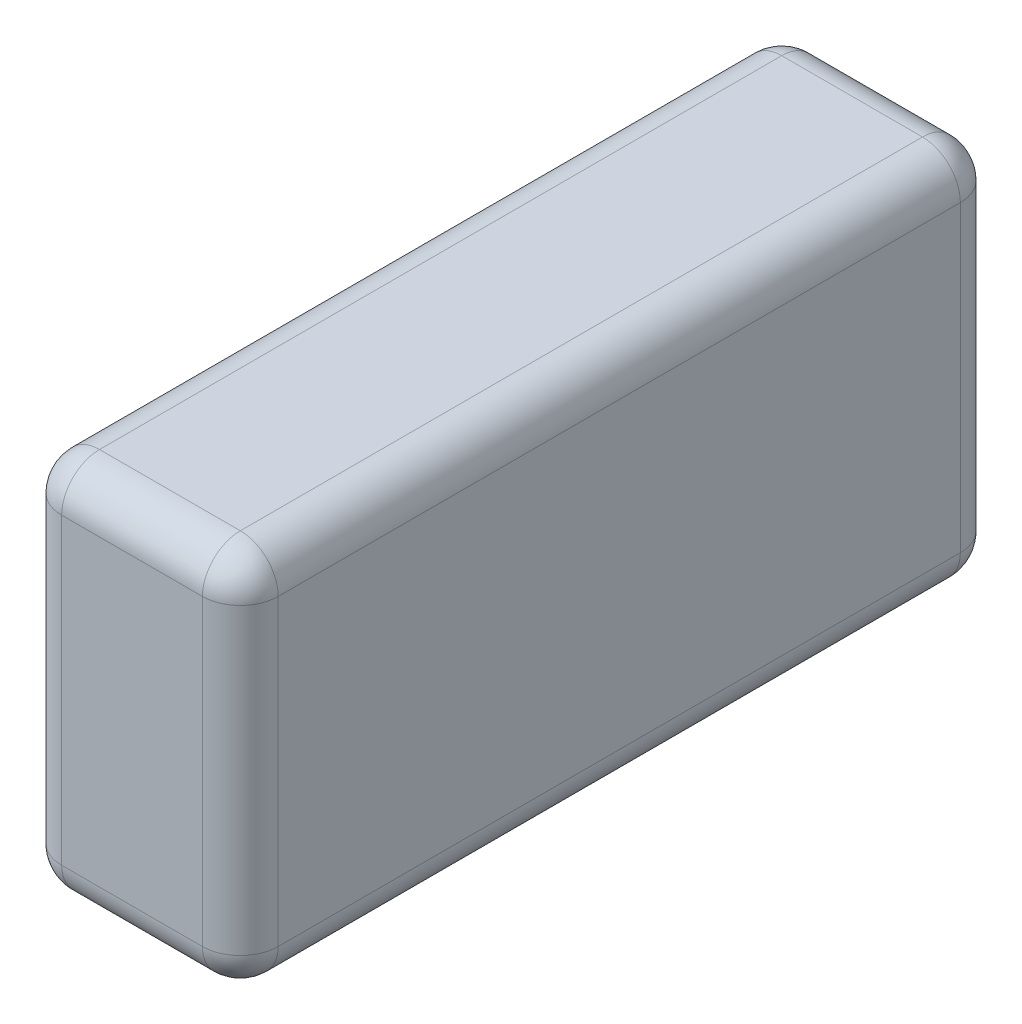
ISO-10303-21;
HEADER;
FILE_DESCRIPTION(('STEP AP214'),'2;1');
FILE_NAME('part.step','',(''),(''),'','','');
FILE_SCHEMA(('AUTOMOTIVE_DESIGN { 1 0 10303 214 1 1 1 1 }'));
ENDSEC;
DATA;
#1=APPLICATION_CONTEXT('core data for automotive mechanical design processes');
#2=APPLICATION_PROTOCOL_DEFINITION('international standard','automotive_design',2000,#1);
#3=PRODUCT_CONTEXT('',#1,'mechanical');
#4=PRODUCT('Part','Part','',(#3));
#5=PRODUCT_RELATED_PRODUCT_CATEGORY('part','',(#4));
#6=PRODUCT_DEFINITION_FORMATION('','',#4);
#7=PRODUCT_DEFINITION_CONTEXT('part definition',#1,'design');
#8=PRODUCT_DEFINITION('design','',#6,#7);
#9=PRODUCT_DEFINITION_SHAPE('','',#8);
#10=(LENGTH_UNIT() NAMED_UNIT(*) SI_UNIT(.MILLI.,.METRE.));
#11=(NAMED_UNIT(*) PLANE_ANGLE_UNIT() SI_UNIT($,.RADIAN.));
#12=(NAMED_UNIT(*) SI_UNIT($,.STERADIAN.) SOLID_ANGLE_UNIT());
#13=UNCERTAINTY_MEASURE_WITH_UNIT(LENGTH_MEASURE(1.E-05),#10,'distance_accuracy_value','');
#14=(GEOMETRIC_REPRESENTATION_CONTEXT(3) GLOBAL_UNCERTAINTY_ASSIGNED_CONTEXT((#13)) GLOBAL_UNIT_ASSIGNED_CONTEXT((#10,
#11,#12)) REPRESENTATION_CONTEXT('',''));
#15=CARTESIAN_POINT('',(0.,0.,0.));
#16=DIRECTION('',(0.,0.,1.));
#17=DIRECTION('',(1.,0.,0.));
#18=AXIS2_PLACEMENT_3D('',#15,#16,#17);
#19=CARTESIAN_POINT('',(-200.,0.,0.));
#20=DIRECTION('',(0.,0.,1.));
#21=DIRECTION('',(1.,0.,0.));
#22=AXIS2_PLACEMENT_3D('',#19,#20,#21);
#23=PLANE('',#22);
#24=DIRECTION('',(1.,0.,0.));
#25=VECTOR('',#24,1.);
#26=CARTESIAN_POINT('',(-200.,315.,0.));
#27=LINE('',#26,#25);
#28=CARTESIAN_POINT('',(-35.,315.,0.));
#29=VERTEX_POINT('',#28);
#30=CARTESIAN_POINT('',(-165.,315.,0.));
#31=VERTEX_POINT('',#30);
#32=EDGE_CURVE('E129',#29,#31,#27,.F.);
#33=ORIENTED_EDGE('',*,*,#32,.T.);
#34=DIRECTION('',(0.,-1.,0.));
#35=VECTOR('',#34,1.);
#36=CARTESIAN_POINT('',(-165.,0.,0.));
#37=LINE('',#36,#35);
#38=CARTESIAN_POINT('',(-165.,35.,0.));
#39=VERTEX_POINT('',#38);
#40=EDGE_CURVE('E166',#31,#39,#37,.T.);
#41=ORIENTED_EDGE('',*,*,#40,.T.);
#42=DIRECTION('',(1.,0.,0.));
#43=VECTOR('',#42,1.);
#44=CARTESIAN_POINT('',(-200.,35.,0.));
#45=LINE('',#44,#43);
#46=CARTESIAN_POINT('',(-35.,35.,0.));
#47=VERTEX_POINT('',#46);
#48=EDGE_CURVE('E163',#39,#47,#45,.T.);
#49=ORIENTED_EDGE('',*,*,#48,.T.);
#50=DIRECTION('',(0.,-1.,0.));
#51=VECTOR('',#50,1.);
#52=CARTESIAN_POINT('',(-35.,350.,0.));
#53=LINE('',#52,#51);
#54=EDGE_CURVE('E158',#47,#29,#53,.F.);
#55=ORIENTED_EDGE('',*,*,#54,.T.);
#56=EDGE_LOOP('',(#33,#41,#49,#55));
#57=FACE_BOUND('',#56,.T.);
#58=ADVANCED_FACE('F33',(#57),#23,.T.);
#59=CARTESIAN_POINT('',(-200.,350.,0.));
#60=DIRECTION('',(0.,1.,0.));
#61=DIRECTION('',(0.,0.,1.));
#62=AXIS2_PLACEMENT_3D('',#59,#60,#61);
#63=PLANE('',#62);
#64=DIRECTION('',(1.,0.,0.));
#65=VECTOR('',#64,1.);
#66=CARTESIAN_POINT('',(-200.,350.,-665.));
#67=LINE('',#66,#65);
#68=CARTESIAN_POINT('',(-35.,350.,-665.));
#69=VERTEX_POINT('',#68);
#70=CARTESIAN_POINT('',(-165.,350.,-665.));
#71=VERTEX_POINT('',#70);
#72=EDGE_CURVE('E151',#69,#71,#67,.F.);
#73=ORIENTED_EDGE('',*,*,#72,.T.);
#74=DIRECTION('',(0.,0.,1.));
#75=VECTOR('',#74,1.);
#76=CARTESIAN_POINT('',(-165.,350.,0.));
#77=LINE('',#76,#75);
#78=CARTESIAN_POINT('',(-165.,350.,-35.));
#79=VERTEX_POINT('',#78);
#80=EDGE_CURVE('E155',#71,#79,#77,.T.);
#81=ORIENTED_EDGE('',*,*,#80,.T.);
#82=DIRECTION('',(1.,0.,0.));
#83=VECTOR('',#82,1.);
#84=CARTESIAN_POINT('',(-200.,350.,-35.));
#85=LINE('',#84,#83);
#86=CARTESIAN_POINT('',(-35.,350.,-35.));
#87=VERTEX_POINT('',#86);
#88=EDGE_CURVE('E127',#79,#87,#85,.T.);
#89=ORIENTED_EDGE('',*,*,#88,.T.);
#90=DIRECTION('',(0.,0.,1.));
#91=VECTOR('',#90,1.);
#92=CARTESIAN_POINT('',(-35.,350.,-700.));
#93=LINE('',#92,#91);
#94=EDGE_CURVE('E145',#87,#69,#93,.F.);
#95=ORIENTED_EDGE('',*,*,#94,.T.);
#96=EDGE_LOOP('',(#73,#81,#89,#95));
#97=FACE_BOUND('',#96,.T.);
#98=ADVANCED_FACE('F153',(#97),#63,.T.);
#99=CARTESIAN_POINT('',(-200.,0.,-700.));
#100=DIRECTION('',(0.,0.,-1.));
#101=DIRECTION('',(-1.,0.,0.));
#102=AXIS2_PLACEMENT_3D('',#99,#100,#101);
#103=PLANE('',#102);
#104=DIRECTION('',(1.,0.,0.));
#105=VECTOR('',#104,1.);
#106=CARTESIAN_POINT('',(-200.,35.,-700.));
#107=LINE('',#106,#105);
#108=CARTESIAN_POINT('',(-35.,35.,-700.));
#109=VERTEX_POINT('',#108);
#110=CARTESIAN_POINT('',(-165.,35.,-700.));
#111=VERTEX_POINT('',#110);
#112=EDGE_CURVE('E170',#109,#111,#107,.F.);
#113=ORIENTED_EDGE('',*,*,#112,.T.);
#114=DIRECTION('',(0.,1.,0.));
#115=VECTOR('',#114,1.);
#116=CARTESIAN_POINT('',(-165.,0.,-700.));
#117=LINE('',#116,#115);
#118=CARTESIAN_POINT('',(-165.,315.,-700.));
#119=VERTEX_POINT('',#118);
#120=EDGE_CURVE('E175',#111,#119,#117,.T.);
#121=ORIENTED_EDGE('',*,*,#120,.T.);
#122=DIRECTION('',(1.,0.,0.));
#123=VECTOR('',#122,1.);
#124=CARTESIAN_POINT('',(-200.,315.,-700.));
#125=LINE('',#124,#123);
#126=CARTESIAN_POINT('',(-35.,315.,-700.));
#127=VERTEX_POINT('',#126);
#128=EDGE_CURVE('E172',#119,#127,#125,.T.);
#129=ORIENTED_EDGE('',*,*,#128,.T.);
#130=DIRECTION('',(0.,1.,0.));
#131=VECTOR('',#130,1.);
#132=CARTESIAN_POINT('',(-35.,0.,-700.));
#133=LINE('',#132,#131);
#134=EDGE_CURVE('E168',#127,#109,#133,.F.);
#135=ORIENTED_EDGE('',*,*,#134,.T.);
#136=EDGE_LOOP('',(#113,#121,#129,#135));
#137=FACE_BOUND('',#136,.T.);
#138=ADVANCED_FACE('F280',(#137),#103,.T.);
#139=CARTESIAN_POINT('',(-200.,0.,0.));
#140=DIRECTION('',(0.,-1.,0.));
#141=DIRECTION('',(0.,0.,-1.));
#142=AXIS2_PLACEMENT_3D('',#139,#140,#141);
#143=PLANE('',#142);
#144=DIRECTION('',(1.,0.,0.));
#145=VECTOR('',#144,1.);
#146=CARTESIAN_POINT('',(-200.,0.,-35.));
#147=LINE('',#146,#145);
#148=CARTESIAN_POINT('',(-35.,0.,-35.));
#149=VERTEX_POINT('',#148);
#150=CARTESIAN_POINT('',(-165.,0.,-35.));
#151=VERTEX_POINT('',#150);
#152=EDGE_CURVE('E179',#149,#151,#147,.F.);
#153=ORIENTED_EDGE('',*,*,#152,.T.);
#154=DIRECTION('',(0.,0.,-1.));
#155=VECTOR('',#154,1.);
#156=CARTESIAN_POINT('',(-165.,0.,0.));
#157=LINE('',#156,#155);
#158=CARTESIAN_POINT('',(-165.,0.,-665.));
#159=VERTEX_POINT('',#158);
#160=EDGE_CURVE('E184',#151,#159,#157,.T.);
#161=ORIENTED_EDGE('',*,*,#160,.T.);
#162=DIRECTION('',(1.,0.,0.));
#163=VECTOR('',#162,1.);
#164=CARTESIAN_POINT('',(-200.,0.,-665.));
#165=LINE('',#164,#163);
#166=CARTESIAN_POINT('',(-35.,0.,-665.));
#167=VERTEX_POINT('',#166);
#168=EDGE_CURVE('E181',#159,#167,#165,.T.);
#169=ORIENTED_EDGE('',*,*,#168,.T.);
#170=DIRECTION('',(0.,0.,-1.));
#171=VECTOR('',#170,1.);
#172=CARTESIAN_POINT('',(-35.,0.,0.));
#173=LINE('',#172,#171);
#174=EDGE_CURVE('E177',#167,#149,#173,.F.);
#175=ORIENTED_EDGE('',*,*,#174,.T.);
#176=EDGE_LOOP('',(#153,#161,#169,#175));
#177=FACE_BOUND('',#176,.T.);
#178=ADVANCED_FACE('F291',(#177),#143,.T.);
#179=CARTESIAN_POINT('',(-200.,0.,0.));
#180=DIRECTION('',(-1.,0.,0.));
#181=DIRECTION('',(0.,0.,1.));
#182=AXIS2_PLACEMENT_3D('',#179,#180,#181);
#183=PLANE('',#182);
#184=DIRECTION('',(0.,1.,0.));
#185=VECTOR('',#184,1.);
#186=CARTESIAN_POINT('',(-200.,0.,-665.));
#187=LINE('',#186,#185);
#188=CARTESIAN_POINT('',(-200.,315.,-665.));
#189=VERTEX_POINT('',#188);
#190=CARTESIAN_POINT('',(-200.,35.,-665.));
#191=VERTEX_POINT('',#190);
#192=EDGE_CURVE('E190',#189,#191,#187,.F.);
#193=ORIENTED_EDGE('',*,*,#192,.T.);
#194=DIRECTION('',(0.,0.,-1.));
#195=VECTOR('',#194,1.);
#196=CARTESIAN_POINT('',(-200.,35.,0.));
#197=LINE('',#196,#195);
#198=CARTESIAN_POINT('',(-200.,35.,-35.));
#199=VERTEX_POINT('',#198);
#200=EDGE_CURVE('E192',#191,#199,#197,.F.);
#201=ORIENTED_EDGE('',*,*,#200,.T.);
#202=DIRECTION('',(0.,-1.,0.));
#203=VECTOR('',#202,1.);
#204=CARTESIAN_POINT('',(-200.,0.,-35.));
#205=LINE('',#204,#203);
#206=CARTESIAN_POINT('',(-200.,315.,-35.));
#207=VERTEX_POINT('',#206);
#208=EDGE_CURVE('E186',#199,#207,#205,.F.);
#209=ORIENTED_EDGE('',*,*,#208,.T.);
#210=DIRECTION('',(0.,0.,1.));
#211=VECTOR('',#210,1.);
#212=CARTESIAN_POINT('',(-200.,315.,0.));
#213=LINE('',#212,#211);
#214=EDGE_CURVE('E188',#207,#189,#213,.F.);
#215=ORIENTED_EDGE('',*,*,#214,.T.);
#216=EDGE_LOOP('',(#193,#201,#209,#215));
#217=FACE_BOUND('',#216,.T.);
#218=ADVANCED_FACE('F272',(#217),#183,.T.);
#219=CARTESIAN_POINT('',(0.,0.,0.));
#220=DIRECTION('',(-1.,0.,0.));
#221=DIRECTION('',(0.,0.,1.));
#222=AXIS2_PLACEMENT_3D('',#219,#220,#221);
#223=PLANE('',#222);
#224=DIRECTION('',(0.,1.,0.));
#225=VECTOR('',#224,1.);
#226=CARTESIAN_POINT('',(0.,350.,-665.));
#227=LINE('',#226,#225);
#228=CARTESIAN_POINT('',(0.,35.,-665.));
#229=VERTEX_POINT('',#228);
#230=CARTESIAN_POINT('',(0.,315.,-665.));
#231=VERTEX_POINT('',#230);
#232=EDGE_CURVE('E42',#229,#231,#227,.T.);
#233=ORIENTED_EDGE('',*,*,#232,.T.);
#234=DIRECTION('',(0.,0.,1.));
#235=VECTOR('',#234,1.);
#236=CARTESIAN_POINT('',(0.,315.,0.));
#237=LINE('',#236,#235);
#238=CARTESIAN_POINT('',(0.,315.,-35.));
#239=VERTEX_POINT('',#238);
#240=EDGE_CURVE('E11',#231,#239,#237,.T.);
#241=ORIENTED_EDGE('',*,*,#240,.T.);
#242=DIRECTION('',(0.,-1.,0.));
#243=VECTOR('',#242,1.);
#244=CARTESIAN_POINT('',(0.,0.,-35.));
#245=LINE('',#244,#243);
#246=CARTESIAN_POINT('',(0.,35.,-35.));
#247=VERTEX_POINT('',#246);
#248=EDGE_CURVE('E195',#239,#247,#245,.T.);
#249=ORIENTED_EDGE('',*,*,#248,.T.);
#250=DIRECTION('',(0.,0.,-1.));
#251=VECTOR('',#250,1.);
#252=CARTESIAN_POINT('',(0.,35.,-700.));
#253=LINE('',#252,#251);
#254=EDGE_CURVE('E53',#247,#229,#253,.T.);
#255=ORIENTED_EDGE('',*,*,#254,.T.);
#256=EDGE_LOOP('',(#233,#241,#249,#255));
#257=FACE_BOUND('',#256,.T.);
#258=ADVANCED_FACE('F479',(#257),#223,.F.);
#259=CARTESIAN_POINT('',(-200.,35.,-665.));
#260=DIRECTION('',(1.,0.,0.));
#261=DIRECTION('',(0.,0.,-1.));
#262=AXIS2_PLACEMENT_3D('',#259,#260,#261);
#263=CYLINDRICAL_SURFACE('',#262,35.);
#264=CARTESIAN_POINT('',(-165.,35.,-665.));
#265=DIRECTION('',(-1.,0.,0.));
#266=DIRECTION('',(0.,0.,1.));
#267=AXIS2_PLACEMENT_3D('',#264,#265,#266);
#268=CIRCLE('',#267,35.);
#269=EDGE_CURVE('E37',#111,#159,#268,.T.);
#270=ORIENTED_EDGE('',*,*,#269,.F.);
#271=ORIENTED_EDGE('',*,*,#112,.F.);
#272=CARTESIAN_POINT('',(-35.,35.,-665.));
#273=DIRECTION('',(1.,0.,0.));
#274=DIRECTION('',(0.,0.,-1.));
#275=AXIS2_PLACEMENT_3D('',#272,#273,#274);
#276=CIRCLE('',#275,35.);
#277=EDGE_CURVE('E249',#167,#109,#276,.T.);
#278=ORIENTED_EDGE('',*,*,#277,.F.);
#279=ORIENTED_EDGE('',*,*,#168,.F.);
#280=EDGE_LOOP('',(#270,#271,#278,#279));
#281=FACE_BOUND('',#280,.T.);
#282=ADVANCED_FACE('F35',(#281),#263,.T.);
#283=CARTESIAN_POINT('',(-165.,35.,-665.));
#284=DIRECTION('',(0.,0.,1.));
#285=DIRECTION('',(1.,0.,0.));
#286=AXIS2_PLACEMENT_3D('',#283,#284,#285);
#287=SPHERICAL_SURFACE('',#286,35.);
#288=CARTESIAN_POINT('',(-165.,35.,-665.));
#289=DIRECTION('',(0.,-1.,0.));
#290=DIRECTION('',(0.,0.,-1.));
#291=AXIS2_PLACEMENT_3D('',#288,#289,#290);
#292=CIRCLE('',#291,35.);
#293=EDGE_CURVE('E244',#111,#191,#292,.F.);
#294=ORIENTED_EDGE('',*,*,#293,.F.);
#295=ORIENTED_EDGE('',*,*,#269,.T.);
#296=CARTESIAN_POINT('',(-165.,35.,-665.));
#297=DIRECTION('',(0.,0.,-1.));
#298=DIRECTION('',(-1.,0.,0.));
#299=AXIS2_PLACEMENT_3D('',#296,#297,#298);
#300=CIRCLE('',#299,35.);
#301=EDGE_CURVE('E247',#191,#159,#300,.F.);
#302=ORIENTED_EDGE('',*,*,#301,.F.);
#303=EDGE_LOOP('',(#294,#295,#302));
#304=FACE_BOUND('',#303,.T.);
#305=ADVANCED_FACE('F260',(#304),#287,.T.);
#306=CARTESIAN_POINT('',(-35.,35.,-665.));
#307=DIRECTION('',(0.,0.,1.));
#308=DIRECTION('',(1.,0.,0.));
#309=AXIS2_PLACEMENT_3D('',#306,#307,#308);
#310=SPHERICAL_SURFACE('',#309,35.);
#311=CARTESIAN_POINT('',(-35.,35.,-665.));
#312=DIRECTION('',(0.,0.,-1.));
#313=DIRECTION('',(-1.,0.,0.));
#314=AXIS2_PLACEMENT_3D('',#311,#312,#313);
#315=CIRCLE('',#314,35.);
#316=EDGE_CURVE('E239',#167,#229,#315,.F.);
#317=ORIENTED_EDGE('',*,*,#316,.F.);
#318=ORIENTED_EDGE('',*,*,#277,.T.);
#319=CARTESIAN_POINT('',(-35.,35.,-665.));
#320=DIRECTION('',(0.,-1.,0.));
#321=DIRECTION('',(0.,0.,-1.));
#322=AXIS2_PLACEMENT_3D('',#319,#320,#321);
#323=CIRCLE('',#322,35.);
#324=EDGE_CURVE('E241',#229,#109,#323,.F.);
#325=ORIENTED_EDGE('',*,*,#324,.F.);
#326=EDGE_LOOP('',(#317,#318,#325));
#327=FACE_BOUND('',#326,.T.);
#328=ADVANCED_FACE('F458',(#327),#310,.T.);
#329=CARTESIAN_POINT('',(-165.,35.,0.));
#330=DIRECTION('',(0.,0.,-1.));
#331=DIRECTION('',(-1.,0.,0.));
#332=AXIS2_PLACEMENT_3D('',#329,#330,#331);
#333=CYLINDRICAL_SURFACE('',#332,35.);
#334=ORIENTED_EDGE('',*,*,#301,.T.);
#335=ORIENTED_EDGE('',*,*,#160,.F.);
#336=CARTESIAN_POINT('',(-165.,35.,-35.));
#337=DIRECTION('',(0.,0.,1.));
#338=DIRECTION('',(1.,0.,0.));
#339=AXIS2_PLACEMENT_3D('',#336,#337,#338);
#340=CIRCLE('',#339,35.);
#341=EDGE_CURVE('E233',#199,#151,#340,.T.);
#342=ORIENTED_EDGE('',*,*,#341,.F.);
#343=ORIENTED_EDGE('',*,*,#200,.F.);
#344=EDGE_LOOP('',(#334,#335,#342,#343));
#345=FACE_BOUND('',#344,.T.);
#346=ADVANCED_FACE('F268',(#345),#333,.T.);
#347=CARTESIAN_POINT('',(-165.,0.,-665.));
#348=DIRECTION('',(0.,1.,0.));
#349=DIRECTION('',(0.,0.,1.));
#350=AXIS2_PLACEMENT_3D('',#347,#348,#349);
#351=CYLINDRICAL_SURFACE('',#350,35.);
#352=ORIENTED_EDGE('',*,*,#293,.T.);
#353=ORIENTED_EDGE('',*,*,#192,.F.);
#354=CARTESIAN_POINT('',(-165.,315.,-665.));
#355=DIRECTION('',(0.,1.,0.));
#356=DIRECTION('',(0.,0.,1.));
#357=AXIS2_PLACEMENT_3D('',#354,#355,#356);
#358=CIRCLE('',#357,35.);
#359=EDGE_CURVE('E230',#119,#189,#358,.T.);
#360=ORIENTED_EDGE('',*,*,#359,.F.);
#361=ORIENTED_EDGE('',*,*,#120,.F.);
#362=EDGE_LOOP('',(#352,#353,#360,#361));
#363=FACE_BOUND('',#362,.T.);
#364=ADVANCED_FACE('F277',(#363),#351,.T.);
#365=CARTESIAN_POINT('',(-200.,315.,-665.));
#366=DIRECTION('',(1.,0.,0.));
#367=DIRECTION('',(0.,0.,-1.));
#368=AXIS2_PLACEMENT_3D('',#365,#366,#367);
#369=CYLINDRICAL_SURFACE('',#368,35.);
#370=CARTESIAN_POINT('',(-35.,315.,-665.));
#371=DIRECTION('',(1.,0.,0.));
#372=DIRECTION('',(0.,0.,-1.));
#373=AXIS2_PLACEMENT_3D('',#370,#371,#372);
#374=CIRCLE('',#373,35.);
#375=EDGE_CURVE('E224',#127,#69,#374,.T.);
#376=ORIENTED_EDGE('',*,*,#375,.F.);
#377=ORIENTED_EDGE('',*,*,#128,.F.);
#378=CARTESIAN_POINT('',(-165.,315.,-665.));
#379=DIRECTION('',(-1.,0.,0.));
#380=DIRECTION('',(0.,0.,1.));
#381=AXIS2_PLACEMENT_3D('',#378,#379,#380);
#382=CIRCLE('',#381,35.);
#383=EDGE_CURVE('E227',#71,#119,#382,.T.);
#384=ORIENTED_EDGE('',*,*,#383,.F.);
#385=ORIENTED_EDGE('',*,*,#72,.F.);
#386=EDGE_LOOP('',(#376,#377,#384,#385));
#387=FACE_BOUND('',#386,.T.);
#388=ADVANCED_FACE('F284',(#387),#369,.T.);
#389=CARTESIAN_POINT('',(-35.,0.,-665.));
#390=DIRECTION('',(0.,-1.,0.));
#391=DIRECTION('',(0.,0.,-1.));
#392=AXIS2_PLACEMENT_3D('',#389,#390,#391);
#393=CYLINDRICAL_SURFACE('',#392,35.);
#394=ORIENTED_EDGE('',*,*,#324,.T.);
#395=ORIENTED_EDGE('',*,*,#134,.F.);
#396=CARTESIAN_POINT('',(-35.,315.,-665.));
#397=DIRECTION('',(0.,1.,0.));
#398=DIRECTION('',(0.,0.,1.));
#399=AXIS2_PLACEMENT_3D('',#396,#397,#398);
#400=CIRCLE('',#399,35.);
#401=EDGE_CURVE('E222',#231,#127,#400,.T.);
#402=ORIENTED_EDGE('',*,*,#401,.F.);
#403=ORIENTED_EDGE('',*,*,#232,.F.);
#404=EDGE_LOOP('',(#394,#395,#402,#403));
#405=FACE_BOUND('',#404,.T.);
#406=ADVANCED_FACE('F289',(#405),#393,.T.);
#407=CARTESIAN_POINT('',(-35.,35.,0.));
#408=DIRECTION('',(0.,0.,1.));
#409=DIRECTION('',(1.,0.,0.));
#410=AXIS2_PLACEMENT_3D('',#407,#408,#409);
#411=CYLINDRICAL_SURFACE('',#410,35.);
#412=ORIENTED_EDGE('',*,*,#316,.T.);
#413=ORIENTED_EDGE('',*,*,#254,.F.);
#414=CARTESIAN_POINT('',(-35.,35.,-35.));
#415=DIRECTION('',(0.,0.,1.));
#416=DIRECTION('',(1.,0.,0.));
#417=AXIS2_PLACEMENT_3D('',#414,#415,#416);
#418=CIRCLE('',#417,35.);
#419=EDGE_CURVE('E219',#149,#247,#418,.T.);
#420=ORIENTED_EDGE('',*,*,#419,.F.);
#421=ORIENTED_EDGE('',*,*,#174,.F.);
#422=EDGE_LOOP('',(#412,#413,#420,#421));
#423=FACE_BOUND('',#422,.T.);
#424=ADVANCED_FACE('F300',(#423),#411,.T.);
#425=CARTESIAN_POINT('',(-200.,35.,-35.));
#426=DIRECTION('',(1.,0.,0.));
#427=DIRECTION('',(0.,0.,-1.));
#428=AXIS2_PLACEMENT_3D('',#425,#426,#427);
#429=CYLINDRICAL_SURFACE('',#428,35.);
#430=CARTESIAN_POINT('',(-165.,35.,-35.));
#431=DIRECTION('',(-1.,0.,0.));
#432=DIRECTION('',(0.,0.,1.));
#433=AXIS2_PLACEMENT_3D('',#430,#431,#432);
#434=CIRCLE('',#433,35.);
#435=EDGE_CURVE('E236',#151,#39,#434,.T.);
#436=ORIENTED_EDGE('',*,*,#435,.F.);
#437=ORIENTED_EDGE('',*,*,#152,.F.);
#438=CARTESIAN_POINT('',(-35.,35.,-35.));
#439=DIRECTION('',(1.,0.,0.));
#440=DIRECTION('',(0.,0.,-1.));
#441=AXIS2_PLACEMENT_3D('',#438,#439,#440);
#442=CIRCLE('',#441,35.);
#443=EDGE_CURVE('E216',#47,#149,#442,.T.);
#444=ORIENTED_EDGE('',*,*,#443,.F.);
#445=ORIENTED_EDGE('',*,*,#48,.F.);
#446=EDGE_LOOP('',(#436,#437,#444,#445));
#447=FACE_BOUND('',#446,.T.);
#448=ADVANCED_FACE('F296',(#447),#429,.T.);
#449=CARTESIAN_POINT('',(-165.,35.,-35.));
#450=DIRECTION('',(0.,0.,1.));
#451=DIRECTION('',(1.,0.,0.));
#452=AXIS2_PLACEMENT_3D('',#449,#450,#451);
#453=SPHERICAL_SURFACE('',#452,35.);
#454=ORIENTED_EDGE('',*,*,#341,.T.);
#455=ORIENTED_EDGE('',*,*,#435,.T.);
#456=CARTESIAN_POINT('',(-165.,35.,-35.));
#457=DIRECTION('',(0.,-1.,0.));
#458=DIRECTION('',(0.,0.,-1.));
#459=AXIS2_PLACEMENT_3D('',#456,#457,#458);
#460=CIRCLE('',#459,35.);
#461=EDGE_CURVE('E213',#199,#39,#460,.F.);
#462=ORIENTED_EDGE('',*,*,#461,.F.);
#463=EDGE_LOOP('',(#454,#455,#462));
#464=FACE_BOUND('',#463,.T.);
#465=ADVANCED_FACE('F310',(#464),#453,.T.);
#466=CARTESIAN_POINT('',(-165.,315.,-665.));
#467=DIRECTION('',(0.,0.,1.));
#468=DIRECTION('',(1.,0.,0.));
#469=AXIS2_PLACEMENT_3D('',#466,#467,#468);
#470=SPHERICAL_SURFACE('',#469,35.);
#471=ORIENTED_EDGE('',*,*,#383,.T.);
#472=ORIENTED_EDGE('',*,*,#359,.T.);
#473=CARTESIAN_POINT('',(-165.,315.,-665.));
#474=DIRECTION('',(0.,0.,-1.));
#475=DIRECTION('',(-1.,0.,0.));
#476=AXIS2_PLACEMENT_3D('',#473,#474,#475);
#477=CIRCLE('',#476,35.);
#478=EDGE_CURVE('E210',#71,#189,#477,.F.);
#479=ORIENTED_EDGE('',*,*,#478,.F.);
#480=EDGE_LOOP('',(#471,#472,#479));
#481=FACE_BOUND('',#480,.T.);
#482=ADVANCED_FACE('F320',(#481),#470,.T.);
#483=CARTESIAN_POINT('',(-35.,315.,-665.));
#484=DIRECTION('',(0.,0.,1.));
#485=DIRECTION('',(1.,0.,0.));
#486=AXIS2_PLACEMENT_3D('',#483,#484,#485);
#487=SPHERICAL_SURFACE('',#486,35.);
#488=ORIENTED_EDGE('',*,*,#401,.T.);
#489=ORIENTED_EDGE('',*,*,#375,.T.);
#490=CARTESIAN_POINT('',(-35.,315.,-665.));
#491=DIRECTION('',(0.,0.,-1.));
#492=DIRECTION('',(-1.,0.,0.));
#493=AXIS2_PLACEMENT_3D('',#490,#491,#492);
#494=CIRCLE('',#493,35.);
#495=EDGE_CURVE('E148',#231,#69,#494,.F.);
#496=ORIENTED_EDGE('',*,*,#495,.F.);
#497=EDGE_LOOP('',(#488,#489,#496));
#498=FACE_BOUND('',#497,.T.);
#499=ADVANCED_FACE('F322',(#498),#487,.T.);
#500=CARTESIAN_POINT('',(-35.,35.,-35.));
#501=DIRECTION('',(0.,0.,1.));
#502=DIRECTION('',(1.,0.,0.));
#503=AXIS2_PLACEMENT_3D('',#500,#501,#502);
#504=SPHERICAL_SURFACE('',#503,35.);
#505=ORIENTED_EDGE('',*,*,#443,.T.);
#506=ORIENTED_EDGE('',*,*,#419,.T.);
#507=CARTESIAN_POINT('',(-35.,35.,-35.));
#508=DIRECTION('',(0.,-1.,0.));
#509=DIRECTION('',(0.,0.,-1.));
#510=AXIS2_PLACEMENT_3D('',#507,#508,#509);
#511=CIRCLE('',#510,35.);
#512=EDGE_CURVE('E206',#47,#247,#511,.F.);
#513=ORIENTED_EDGE('',*,*,#512,.F.);
#514=EDGE_LOOP('',(#505,#506,#513));
#515=FACE_BOUND('',#514,.T.);
#516=ADVANCED_FACE('F302',(#515),#504,.T.);
#517=CARTESIAN_POINT('',(-165.,0.,-35.));
#518=DIRECTION('',(0.,-1.,0.));
#519=DIRECTION('',(0.,0.,-1.));
#520=AXIS2_PLACEMENT_3D('',#517,#518,#519);
#521=CYLINDRICAL_SURFACE('',#520,35.);
#522=ORIENTED_EDGE('',*,*,#461,.T.);
#523=ORIENTED_EDGE('',*,*,#40,.F.);
#524=CARTESIAN_POINT('',(-165.,315.,-35.));
#525=DIRECTION('',(0.,1.,0.));
#526=DIRECTION('',(0.,0.,1.));
#527=AXIS2_PLACEMENT_3D('',#524,#525,#526);
#528=CIRCLE('',#527,35.);
#529=EDGE_CURVE('E203',#207,#31,#528,.T.);
#530=ORIENTED_EDGE('',*,*,#529,.F.);
#531=ORIENTED_EDGE('',*,*,#208,.F.);
#532=EDGE_LOOP('',(#522,#523,#530,#531));
#533=FACE_BOUND('',#532,.T.);
#534=ADVANCED_FACE('F312',(#533),#521,.T.);
#535=CARTESIAN_POINT('',(-165.,315.,0.));
#536=DIRECTION('',(0.,0.,1.));
#537=DIRECTION('',(1.,0.,0.));
#538=AXIS2_PLACEMENT_3D('',#535,#536,#537);
#539=CYLINDRICAL_SURFACE('',#538,35.);
#540=ORIENTED_EDGE('',*,*,#478,.T.);
#541=ORIENTED_EDGE('',*,*,#214,.F.);
#542=CARTESIAN_POINT('',(-165.,315.,-35.));
#543=DIRECTION('',(0.,0.,1.));
#544=DIRECTION('',(1.,0.,0.));
#545=AXIS2_PLACEMENT_3D('',#542,#543,#544);
#546=CIRCLE('',#545,35.);
#547=EDGE_CURVE('E142',#79,#207,#546,.T.);
#548=ORIENTED_EDGE('',*,*,#547,.F.);
#549=ORIENTED_EDGE('',*,*,#80,.F.);
#550=EDGE_LOOP('',(#540,#541,#548,#549));
#551=FACE_BOUND('',#550,.T.);
#552=ADVANCED_FACE('F318',(#551),#539,.T.);
#553=CARTESIAN_POINT('',(-35.,315.,0.));
#554=DIRECTION('',(0.,0.,-1.));
#555=DIRECTION('',(-1.,0.,0.));
#556=AXIS2_PLACEMENT_3D('',#553,#554,#555);
#557=CYLINDRICAL_SURFACE('',#556,35.);
#558=ORIENTED_EDGE('',*,*,#495,.T.);
#559=ORIENTED_EDGE('',*,*,#94,.F.);
#560=CARTESIAN_POINT('',(-35.,315.,-35.));
#561=DIRECTION('',(0.,0.,1.));
#562=DIRECTION('',(1.,0.,0.));
#563=AXIS2_PLACEMENT_3D('',#560,#561,#562);
#564=CIRCLE('',#563,35.);
#565=EDGE_CURVE('E134',#239,#87,#564,.T.);
#566=ORIENTED_EDGE('',*,*,#565,.F.);
#567=ORIENTED_EDGE('',*,*,#240,.F.);
#568=EDGE_LOOP('',(#558,#559,#566,#567));
#569=FACE_BOUND('',#568,.T.);
#570=ADVANCED_FACE('F146',(#569),#557,.T.);
#571=CARTESIAN_POINT('',(-35.,0.,-35.));
#572=DIRECTION('',(0.,1.,0.));
#573=DIRECTION('',(0.,0.,1.));
#574=AXIS2_PLACEMENT_3D('',#571,#572,#573);
#575=CYLINDRICAL_SURFACE('',#574,35.);
#576=ORIENTED_EDGE('',*,*,#512,.T.);
#577=ORIENTED_EDGE('',*,*,#248,.F.);
#578=CARTESIAN_POINT('',(-35.,315.,-35.));
#579=DIRECTION('',(0.,1.,0.));
#580=DIRECTION('',(0.,0.,1.));
#581=AXIS2_PLACEMENT_3D('',#578,#579,#580);
#582=CIRCLE('',#581,35.);
#583=EDGE_CURVE('E138',#29,#239,#582,.T.);
#584=ORIENTED_EDGE('',*,*,#583,.F.);
#585=ORIENTED_EDGE('',*,*,#54,.F.);
#586=EDGE_LOOP('',(#576,#577,#584,#585));
#587=FACE_BOUND('',#586,.T.);
#588=ADVANCED_FACE('F305',(#587),#575,.T.);
#589=CARTESIAN_POINT('',(-165.,315.,-35.));
#590=DIRECTION('',(0.,0.,1.));
#591=DIRECTION('',(1.,0.,0.));
#592=AXIS2_PLACEMENT_3D('',#589,#590,#591);
#593=SPHERICAL_SURFACE('',#592,35.);
#594=ORIENTED_EDGE('',*,*,#547,.T.);
#595=ORIENTED_EDGE('',*,*,#529,.T.);
#596=CARTESIAN_POINT('',(-165.,315.,-35.));
#597=DIRECTION('',(-1.,0.,0.));
#598=DIRECTION('',(0.,0.,1.));
#599=AXIS2_PLACEMENT_3D('',#596,#597,#598);
#600=CIRCLE('',#599,35.);
#601=EDGE_CURVE('E131',#79,#31,#600,.F.);
#602=ORIENTED_EDGE('',*,*,#601,.F.);
#603=EDGE_LOOP('',(#594,#595,#602));
#604=FACE_BOUND('',#603,.T.);
#605=ADVANCED_FACE('F316',(#604),#593,.T.);
#606=CARTESIAN_POINT('',(-35.,315.,-35.));
#607=DIRECTION('',(0.,0.,1.));
#608=DIRECTION('',(1.,0.,0.));
#609=AXIS2_PLACEMENT_3D('',#606,#607,#608);
#610=SPHERICAL_SURFACE('',#609,35.);
#611=ORIENTED_EDGE('',*,*,#583,.T.);
#612=ORIENTED_EDGE('',*,*,#565,.T.);
#613=CARTESIAN_POINT('',(-35.,315.,-35.));
#614=DIRECTION('',(1.,0.,0.));
#615=DIRECTION('',(0.,0.,-1.));
#616=AXIS2_PLACEMENT_3D('',#613,#614,#615);
#617=CIRCLE('',#616,35.);
#618=EDGE_CURVE('E123',#29,#87,#617,.F.);
#619=ORIENTED_EDGE('',*,*,#618,.F.);
#620=EDGE_LOOP('',(#611,#612,#619));
#621=FACE_BOUND('',#620,.T.);
#622=ADVANCED_FACE('F136',(#621),#610,.T.);
#623=CARTESIAN_POINT('',(-200.,315.,-35.));
#624=DIRECTION('',(1.,0.,0.));
#625=DIRECTION('',(0.,0.,-1.));
#626=AXIS2_PLACEMENT_3D('',#623,#624,#625);
#627=CYLINDRICAL_SURFACE('',#626,35.);
#628=ORIENTED_EDGE('',*,*,#601,.T.);
#629=ORIENTED_EDGE('',*,*,#32,.F.);
#630=ORIENTED_EDGE('',*,*,#618,.T.);
#631=ORIENTED_EDGE('',*,*,#88,.F.);
#632=EDGE_LOOP('',(#628,#629,#630,#631));
#633=FACE_BOUND('',#632,.T.);
#634=ADVANCED_FACE('F125',(#633),#627,.T.);
#635=CLOSED_SHELL('',(#58,#98,#138,#178,#218,#258,#282,#305,#328,#346,#364,#388,#406,#424,#448,
#465,#482,#499,#516,#534,#552,#570,#588,#605,#622,#634));
#636=MANIFOLD_SOLID_BREP('B2',#635);
#637=ADVANCED_BREP_SHAPE_REPRESENTATION('',(#18,#636),#14);
#638=SHAPE_DEFINITION_REPRESENTATION(#9,#637);
ENDSEC;
END-ISO-10303-21;
